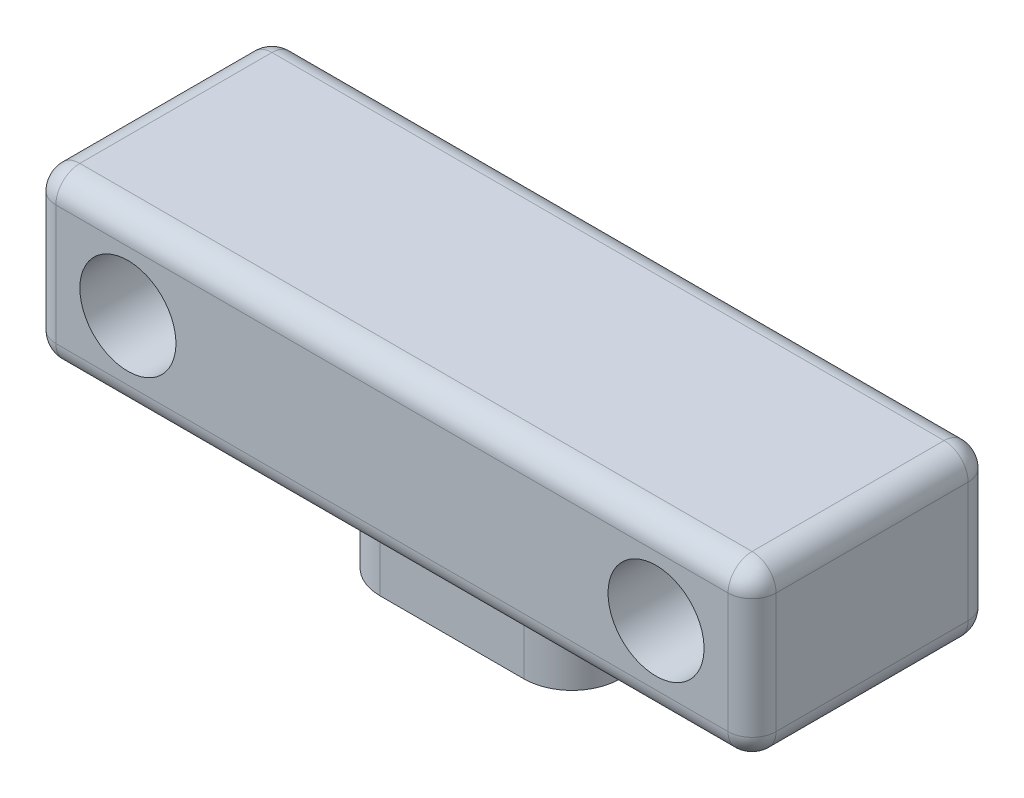
ISO-10303-21;
HEADER;
FILE_DESCRIPTION(('STEP AP214'),'2;1');
FILE_NAME('part.step','',(''),(''),'','','');
FILE_SCHEMA(('AUTOMOTIVE_DESIGN { 1 0 10303 214 1 1 1 1 }'));
ENDSEC;
DATA;
#1=APPLICATION_CONTEXT('core data for automotive mechanical design processes');
#2=APPLICATION_PROTOCOL_DEFINITION('international standard','automotive_design',2000,#1);
#3=PRODUCT_CONTEXT('',#1,'mechanical');
#4=PRODUCT('Part','Part','',(#3));
#5=PRODUCT_RELATED_PRODUCT_CATEGORY('part','',(#4));
#6=PRODUCT_DEFINITION_FORMATION('','',#4);
#7=PRODUCT_DEFINITION_CONTEXT('part definition',#1,'design');
#8=PRODUCT_DEFINITION('design','',#6,#7);
#9=PRODUCT_DEFINITION_SHAPE('','',#8);
#10=(LENGTH_UNIT() NAMED_UNIT(*) SI_UNIT(.MILLI.,.METRE.));
#11=(NAMED_UNIT(*) PLANE_ANGLE_UNIT() SI_UNIT($,.RADIAN.));
#12=(NAMED_UNIT(*) SI_UNIT($,.STERADIAN.) SOLID_ANGLE_UNIT());
#13=UNCERTAINTY_MEASURE_WITH_UNIT(LENGTH_MEASURE(1.E-05),#10,'distance_accuracy_value','');
#14=(GEOMETRIC_REPRESENTATION_CONTEXT(3) GLOBAL_UNCERTAINTY_ASSIGNED_CONTEXT((#13)) GLOBAL_UNIT_ASSIGNED_CONTEXT((#10,
#11,#12)) REPRESENTATION_CONTEXT('',''));
#15=CARTESIAN_POINT('',(0.,0.,0.));
#16=DIRECTION('',(0.,0.,1.));
#17=DIRECTION('',(1.,0.,0.));
#18=AXIS2_PLACEMENT_3D('',#15,#16,#17);
#19=CARTESIAN_POINT('',(0.,-2.,0.));
#20=DIRECTION('',(0.,1.,0.));
#21=DIRECTION('',(0.,0.,1.));
#22=AXIS2_PLACEMENT_3D('',#19,#20,#21);
#23=CYLINDRICAL_SURFACE('',#22,2.);
#24=CARTESIAN_POINT('',(0.,1.85,0.));
#25=DIRECTION('',(0.,1.,0.));
#26=DIRECTION('',(0.,0.,1.));
#27=AXIS2_PLACEMENT_3D('',#24,#25,#26);
#28=CIRCLE('',#27,2.);
#29=CARTESIAN_POINT('',(0.,1.85,2.));
#30=VERTEX_POINT('',#29);
#31=EDGE_CURVE('E331',#30,#30,#28,.T.);
#32=ORIENTED_EDGE('',*,*,#31,.F.);
#33=EDGE_LOOP('',(#32));
#34=FACE_BOUND('',#33,.T.);
#35=CARTESIAN_POINT('',(0.,0.,0.));
#36=DIRECTION('',(0.,-1.,0.));
#37=DIRECTION('',(0.,0.,-1.));
#38=AXIS2_PLACEMENT_3D('',#35,#36,#37);
#39=CIRCLE('',#38,2.);
#40=CARTESIAN_POINT('',(0.,0.,-2.));
#41=VERTEX_POINT('',#40);
#42=EDGE_CURVE('E335',#41,#41,#39,.F.);
#43=ORIENTED_EDGE('',*,*,#42,.T.);
#44=EDGE_LOOP('',(#43));
#45=FACE_BOUND('',#44,.T.);
#46=ADVANCED_FACE('F169',(#34,#45),#23,.T.);
#47=CARTESIAN_POINT('',(15.,8.85,-5.));
#48=DIRECTION('',(-1.,0.,0.));
#49=DIRECTION('',(0.,0.,1.));
#50=AXIS2_PLACEMENT_3D('',#47,#48,#49);
#51=PLANE('',#50);
#52=DIRECTION('',(0.,0.,-1.));
#53=VECTOR('',#52,1.);
#54=CARTESIAN_POINT('',(15.,7.85,5.));
#55=LINE('',#54,#53);
#56=CARTESIAN_POINT('',(15.,7.85,-4.));
#57=VERTEX_POINT('',#56);
#58=CARTESIAN_POINT('',(15.,7.85,4.));
#59=VERTEX_POINT('',#58);
#60=EDGE_CURVE('E395',#57,#59,#55,.F.);
#61=ORIENTED_EDGE('',*,*,#60,.T.);
#62=DIRECTION('',(0.,-1.,0.));
#63=VECTOR('',#62,1.);
#64=CARTESIAN_POINT('',(15.,8.85,4.));
#65=LINE('',#64,#63);
#66=CARTESIAN_POINT('',(15.,2.85,4.));
#67=VERTEX_POINT('',#66);
#68=EDGE_CURVE('E397',#59,#67,#65,.T.);
#69=ORIENTED_EDGE('',*,*,#68,.T.);
#70=DIRECTION('',(0.,0.,-1.));
#71=VECTOR('',#70,1.);
#72=CARTESIAN_POINT('',(15.,2.85,-5.));
#73=LINE('',#72,#71);
#74=CARTESIAN_POINT('',(15.,2.85,-4.));
#75=VERTEX_POINT('',#74);
#76=EDGE_CURVE('E393',#67,#75,#73,.T.);
#77=ORIENTED_EDGE('',*,*,#76,.T.);
#78=DIRECTION('',(0.,-1.,0.));
#79=VECTOR('',#78,1.);
#80=CARTESIAN_POINT('',(15.,8.85,-4.));
#81=LINE('',#80,#79);
#82=EDGE_CURVE('E391',#75,#57,#81,.F.);
#83=ORIENTED_EDGE('',*,*,#82,.T.);
#84=EDGE_LOOP('',(#61,#69,#77,#83));
#85=FACE_BOUND('',#84,.T.);
#86=ADVANCED_FACE('F553',(#85),#51,.F.);
#87=CARTESIAN_POINT('',(-15.,8.85,-5.));
#88=DIRECTION('',(0.,0.,1.));
#89=DIRECTION('',(1.,0.,0.));
#90=AXIS2_PLACEMENT_3D('',#87,#88,#89);
#91=PLANE('',#90);
#92=DIRECTION('',(-1.,0.,0.));
#93=VECTOR('',#92,1.);
#94=CARTESIAN_POINT('',(15.,7.85,-5.));
#95=LINE('',#94,#93);
#96=CARTESIAN_POINT('',(-14.,7.85,-5.));
#97=VERTEX_POINT('',#96);
#98=CARTESIAN_POINT('',(14.,7.85,-5.));
#99=VERTEX_POINT('',#98);
#100=EDGE_CURVE('E404',#97,#99,#95,.F.);
#101=ORIENTED_EDGE('',*,*,#100,.T.);
#102=DIRECTION('',(0.,-1.,0.));
#103=VECTOR('',#102,1.);
#104=CARTESIAN_POINT('',(14.,8.85,-5.));
#105=LINE('',#104,#103);
#106=CARTESIAN_POINT('',(14.,2.85,-5.));
#107=VERTEX_POINT('',#106);
#108=EDGE_CURVE('E406',#99,#107,#105,.T.);
#109=ORIENTED_EDGE('',*,*,#108,.T.);
#110=DIRECTION('',(-1.,0.,0.));
#111=VECTOR('',#110,1.);
#112=CARTESIAN_POINT('',(-15.,2.85,-5.));
#113=LINE('',#112,#111);
#114=CARTESIAN_POINT('',(-14.,2.85,-5.));
#115=VERTEX_POINT('',#114);
#116=EDGE_CURVE('E402',#107,#115,#113,.T.);
#117=ORIENTED_EDGE('',*,*,#116,.T.);
#118=DIRECTION('',(0.,-1.,0.));
#119=VECTOR('',#118,1.);
#120=CARTESIAN_POINT('',(-14.,8.85,-5.));
#121=LINE('',#120,#119);
#122=EDGE_CURVE('E400',#115,#97,#121,.F.);
#123=ORIENTED_EDGE('',*,*,#122,.T.);
#124=EDGE_LOOP('',(#101,#109,#117,#123));
#125=FACE_BOUND('',#124,.T.);
#126=CARTESIAN_POINT('',(11.,5.35,-5.));
#127=DIRECTION('',(0.,0.,-1.));
#128=DIRECTION('',(-1.,0.,0.));
#129=AXIS2_PLACEMENT_3D('',#126,#127,#128);
#130=CIRCLE('',#129,2.);
#131=CARTESIAN_POINT('',(9.,5.35,-5.));
#132=VERTEX_POINT('',#131);
#133=EDGE_CURVE('E492',#132,#132,#130,.T.);
#134=ORIENTED_EDGE('',*,*,#133,.F.);
#135=EDGE_LOOP('',(#134));
#136=FACE_BOUND('',#135,.T.);
#137=CARTESIAN_POINT('',(-11.,5.35,-5.));
#138=DIRECTION('',(0.,0.,-1.));
#139=DIRECTION('',(1.,0.,0.));
#140=AXIS2_PLACEMENT_3D('',#137,#138,#139);
#141=CIRCLE('',#140,2.);
#142=CARTESIAN_POINT('',(-9.,5.35,-5.));
#143=VERTEX_POINT('',#142);
#144=EDGE_CURVE('E487',#143,#143,#141,.T.);
#145=ORIENTED_EDGE('',*,*,#144,.F.);
#146=EDGE_LOOP('',(#145));
#147=FACE_BOUND('',#146,.T.);
#148=ADVANCED_FACE('F560',(#125,#136,#147),#91,.F.);
#149=CARTESIAN_POINT('',(-15.,8.85,-5.));
#150=DIRECTION('',(1.,0.,0.));
#151=DIRECTION('',(0.,0.,-1.));
#152=AXIS2_PLACEMENT_3D('',#149,#150,#151);
#153=PLANE('',#152);
#154=DIRECTION('',(0.,0.,1.));
#155=VECTOR('',#154,1.);
#156=CARTESIAN_POINT('',(-15.,7.85,-5.));
#157=LINE('',#156,#155);
#158=CARTESIAN_POINT('',(-15.,7.85,4.));
#159=VERTEX_POINT('',#158);
#160=CARTESIAN_POINT('',(-15.,7.85,-4.));
#161=VERTEX_POINT('',#160);
#162=EDGE_CURVE('E178',#159,#161,#157,.F.);
#163=ORIENTED_EDGE('',*,*,#162,.T.);
#164=DIRECTION('',(0.,-1.,0.));
#165=VECTOR('',#164,1.);
#166=CARTESIAN_POINT('',(-15.,8.85,-4.));
#167=LINE('',#166,#165);
#168=CARTESIAN_POINT('',(-15.,2.85,-4.));
#169=VERTEX_POINT('',#168);
#170=EDGE_CURVE('E12',#161,#169,#167,.T.);
#171=ORIENTED_EDGE('',*,*,#170,.T.);
#172=DIRECTION('',(0.,0.,1.));
#173=VECTOR('',#172,1.);
#174=CARTESIAN_POINT('',(-15.,2.85,-5.));
#175=LINE('',#174,#173);
#176=CARTESIAN_POINT('',(-15.,2.85,4.));
#177=VERTEX_POINT('',#176);
#178=EDGE_CURVE('E409',#169,#177,#175,.T.);
#179=ORIENTED_EDGE('',*,*,#178,.T.);
#180=DIRECTION('',(0.,-1.,0.));
#181=VECTOR('',#180,1.);
#182=CARTESIAN_POINT('',(-15.,8.85,4.));
#183=LINE('',#182,#181);
#184=EDGE_CURVE('E189',#177,#159,#183,.F.);
#185=ORIENTED_EDGE('',*,*,#184,.T.);
#186=EDGE_LOOP('',(#163,#171,#179,#185));
#187=FACE_BOUND('',#186,.T.);
#188=ADVANCED_FACE('F826',(#187),#153,.F.);
#189=CARTESIAN_POINT('',(-15.,8.85,5.));
#190=DIRECTION('',(0.,0.,-1.));
#191=DIRECTION('',(-1.,0.,0.));
#192=AXIS2_PLACEMENT_3D('',#189,#190,#191);
#193=PLANE('',#192);
#194=DIRECTION('',(1.,0.,0.));
#195=VECTOR('',#194,1.);
#196=CARTESIAN_POINT('',(-15.,2.85,5.));
#197=LINE('',#196,#195);
#198=CARTESIAN_POINT('',(-14.,2.85,5.));
#199=VERTEX_POINT('',#198);
#200=CARTESIAN_POINT('',(14.,2.85,5.));
#201=VERTEX_POINT('',#200);
#202=EDGE_CURVE('E375',#199,#201,#197,.T.);
#203=ORIENTED_EDGE('',*,*,#202,.T.);
#204=DIRECTION('',(0.,-1.,0.));
#205=VECTOR('',#204,1.);
#206=CARTESIAN_POINT('',(14.,8.85,5.));
#207=LINE('',#206,#205);
#208=CARTESIAN_POINT('',(14.,7.85,5.));
#209=VERTEX_POINT('',#208);
#210=EDGE_CURVE('E380',#201,#209,#207,.F.);
#211=ORIENTED_EDGE('',*,*,#210,.T.);
#212=DIRECTION('',(1.,0.,0.));
#213=VECTOR('',#212,1.);
#214=CARTESIAN_POINT('',(-15.,7.85,5.));
#215=LINE('',#214,#213);
#216=CARTESIAN_POINT('',(-14.,7.85,5.));
#217=VERTEX_POINT('',#216);
#218=EDGE_CURVE('E377',#209,#217,#215,.F.);
#219=ORIENTED_EDGE('',*,*,#218,.T.);
#220=DIRECTION('',(0.,-1.,0.));
#221=VECTOR('',#220,1.);
#222=CARTESIAN_POINT('',(-14.,8.85,5.));
#223=LINE('',#222,#221);
#224=EDGE_CURVE('E373',#217,#199,#223,.T.);
#225=ORIENTED_EDGE('',*,*,#224,.T.);
#226=EDGE_LOOP('',(#203,#211,#219,#225));
#227=FACE_BOUND('',#226,.T.);
#228=CARTESIAN_POINT('',(11.,5.35,5.));
#229=DIRECTION('',(0.,0.,-1.));
#230=DIRECTION('',(-1.,0.,0.));
#231=AXIS2_PLACEMENT_3D('',#228,#229,#230);
#232=CIRCLE('',#231,2.);
#233=CARTESIAN_POINT('',(9.,5.35,5.));
#234=VERTEX_POINT('',#233);
#235=EDGE_CURVE('E495',#234,#234,#232,.F.);
#236=ORIENTED_EDGE('',*,*,#235,.F.);
#237=EDGE_LOOP('',(#236));
#238=FACE_BOUND('',#237,.T.);
#239=CARTESIAN_POINT('',(-11.,5.35,5.));
#240=DIRECTION('',(0.,0.,-1.));
#241=DIRECTION('',(-1.,0.,0.));
#242=AXIS2_PLACEMENT_3D('',#239,#240,#241);
#243=CIRCLE('',#242,2.);
#244=CARTESIAN_POINT('',(-13.,5.35,5.));
#245=VERTEX_POINT('',#244);
#246=EDGE_CURVE('E481',#245,#245,#243,.F.);
#247=ORIENTED_EDGE('',*,*,#246,.F.);
#248=EDGE_LOOP('',(#247));
#249=FACE_BOUND('',#248,.T.);
#250=ADVANCED_FACE('F808',(#227,#238,#249),#193,.F.);
#251=CARTESIAN_POINT('',(0.,8.85,0.));
#252=DIRECTION('',(0.,1.,0.));
#253=DIRECTION('',(0.,0.,1.));
#254=AXIS2_PLACEMENT_3D('',#251,#252,#253);
#255=PLANE('',#254);
#256=DIRECTION('',(0.,0.,1.));
#257=VECTOR('',#256,1.);
#258=CARTESIAN_POINT('',(-14.,8.85,5.));
#259=LINE('',#258,#257);
#260=CARTESIAN_POINT('',(-14.,8.85,-4.));
#261=VERTEX_POINT('',#260);
#262=CARTESIAN_POINT('',(-14.,8.85,4.));
#263=VERTEX_POINT('',#262);
#264=EDGE_CURVE('E364',#261,#263,#259,.T.);
#265=ORIENTED_EDGE('',*,*,#264,.T.);
#266=DIRECTION('',(1.,0.,0.));
#267=VECTOR('',#266,1.);
#268=CARTESIAN_POINT('',(15.,8.85,4.));
#269=LINE('',#268,#267);
#270=CARTESIAN_POINT('',(14.,8.85,4.));
#271=VERTEX_POINT('',#270);
#272=EDGE_CURVE('E370',#263,#271,#269,.T.);
#273=ORIENTED_EDGE('',*,*,#272,.T.);
#274=DIRECTION('',(0.,0.,-1.));
#275=VECTOR('',#274,1.);
#276=CARTESIAN_POINT('',(14.,8.85,-5.));
#277=LINE('',#276,#275);
#278=CARTESIAN_POINT('',(14.,8.85,-4.));
#279=VERTEX_POINT('',#278);
#280=EDGE_CURVE('E368',#271,#279,#277,.T.);
#281=ORIENTED_EDGE('',*,*,#280,.T.);
#282=DIRECTION('',(-1.,0.,0.));
#283=VECTOR('',#282,1.);
#284=CARTESIAN_POINT('',(-15.,8.85,-4.));
#285=LINE('',#284,#283);
#286=EDGE_CURVE('E366',#279,#261,#285,.T.);
#287=ORIENTED_EDGE('',*,*,#286,.T.);
#288=EDGE_LOOP('',(#265,#273,#281,#287));
#289=FACE_BOUND('',#288,.T.);
#290=ADVANCED_FACE('F820',(#289),#255,.T.);
#291=CARTESIAN_POINT('',(0.,1.85,0.));
#292=DIRECTION('',(0.,1.,0.));
#293=DIRECTION('',(0.,0.,1.));
#294=AXIS2_PLACEMENT_3D('',#291,#292,#293);
#295=PLANE('',#294);
#296=DIRECTION('',(0.,0.,-1.));
#297=VECTOR('',#296,1.);
#298=CARTESIAN_POINT('',(14.,1.85,0.));
#299=LINE('',#298,#297);
#300=CARTESIAN_POINT('',(14.,1.85,-4.));
#301=VERTEX_POINT('',#300);
#302=CARTESIAN_POINT('',(14.,1.85,4.));
#303=VERTEX_POINT('',#302);
#304=EDGE_CURVE('E386',#301,#303,#299,.F.);
#305=ORIENTED_EDGE('',*,*,#304,.T.);
#306=DIRECTION('',(1.,0.,0.));
#307=VECTOR('',#306,1.);
#308=CARTESIAN_POINT('',(0.,1.85,4.));
#309=LINE('',#308,#307);
#310=CARTESIAN_POINT('',(-14.,1.85,4.));
#311=VERTEX_POINT('',#310);
#312=EDGE_CURVE('E388',#303,#311,#309,.F.);
#313=ORIENTED_EDGE('',*,*,#312,.T.);
#314=DIRECTION('',(0.,0.,1.));
#315=VECTOR('',#314,1.);
#316=CARTESIAN_POINT('',(-14.,1.85,0.));
#317=LINE('',#316,#315);
#318=CARTESIAN_POINT('',(-14.,1.85,-4.));
#319=VERTEX_POINT('',#318);
#320=EDGE_CURVE('E382',#311,#319,#317,.F.);
#321=ORIENTED_EDGE('',*,*,#320,.T.);
#322=DIRECTION('',(-1.,0.,0.));
#323=VECTOR('',#322,1.);
#324=CARTESIAN_POINT('',(0.,1.85,-4.));
#325=LINE('',#324,#323);
#326=EDGE_CURVE('E384',#319,#301,#325,.F.);
#327=ORIENTED_EDGE('',*,*,#326,.T.);
#328=EDGE_LOOP('',(#305,#313,#321,#327));
#329=FACE_BOUND('',#328,.T.);
#330=ORIENTED_EDGE('',*,*,#31,.T.);
#331=EDGE_LOOP('',(#330));
#332=FACE_BOUND('',#331,.T.);
#333=ADVANCED_FACE('F844',(#329,#332),#295,.F.);
#334=CARTESIAN_POINT('',(5.,0.,2.5));
#335=DIRECTION('',(1.,0.,0.));
#336=DIRECTION('',(0.,0.,-1.));
#337=AXIS2_PLACEMENT_3D('',#334,#335,#336);
#338=PLANE('',#337);
#339=DIRECTION('',(0.,0.,1.));
#340=VECTOR('',#339,1.);
#341=CARTESIAN_POINT('',(5.,-2.,2.5));
#342=LINE('',#341,#340);
#343=CARTESIAN_POINT('',(5.,-2.,-0.5));
#344=VERTEX_POINT('',#343);
#345=CARTESIAN_POINT('',(5.,-2.,0.5));
#346=VERTEX_POINT('',#345);
#347=EDGE_CURVE('E508',#344,#346,#342,.T.);
#348=ORIENTED_EDGE('',*,*,#347,.F.);
#349=DIRECTION('',(0.,-1.,0.));
#350=VECTOR('',#349,1.);
#351=CARTESIAN_POINT('',(5.,0.,-0.5));
#352=LINE('',#351,#350);
#353=CARTESIAN_POINT('',(5.,0.,-0.5));
#354=VERTEX_POINT('',#353);
#355=EDGE_CURVE('E346',#344,#354,#352,.F.);
#356=ORIENTED_EDGE('',*,*,#355,.T.);
#357=DIRECTION('',(0.,0.,1.));
#358=VECTOR('',#357,1.);
#359=CARTESIAN_POINT('',(5.,0.,2.5));
#360=LINE('',#359,#358);
#361=CARTESIAN_POINT('',(5.,0.,0.5));
#362=VERTEX_POINT('',#361);
#363=EDGE_CURVE('E326',#354,#362,#360,.T.);
#364=ORIENTED_EDGE('',*,*,#363,.T.);
#365=DIRECTION('',(0.,-1.,0.));
#366=VECTOR('',#365,1.);
#367=CARTESIAN_POINT('',(5.,0.,0.5));
#368=LINE('',#367,#366);
#369=EDGE_CURVE('E343',#362,#346,#368,.T.);
#370=ORIENTED_EDGE('',*,*,#369,.T.);
#371=EDGE_LOOP('',(#348,#356,#364,#370));
#372=FACE_BOUND('',#371,.T.);
#373=ADVANCED_FACE('F530',(#372),#338,.T.);
#374=CARTESIAN_POINT('',(-5.,0.,-2.5));
#375=DIRECTION('',(0.,0.,-1.));
#376=DIRECTION('',(-1.,0.,0.));
#377=AXIS2_PLACEMENT_3D('',#374,#375,#376);
#378=PLANE('',#377);
#379=DIRECTION('',(1.,0.,0.));
#380=VECTOR('',#379,1.);
#381=CARTESIAN_POINT('',(-5.,0.,-2.5));
#382=LINE('',#381,#380);
#383=CARTESIAN_POINT('',(-3.,0.,-2.5));
#384=VERTEX_POINT('',#383);
#385=CARTESIAN_POINT('',(3.,0.,-2.5));
#386=VERTEX_POINT('',#385);
#387=EDGE_CURVE('E506',#384,#386,#382,.T.);
#388=ORIENTED_EDGE('',*,*,#387,.T.);
#389=DIRECTION('',(0.,-1.,0.));
#390=VECTOR('',#389,1.);
#391=CARTESIAN_POINT('',(3.,0.,-2.5));
#392=LINE('',#391,#390);
#393=CARTESIAN_POINT('',(3.,-2.,-2.5));
#394=VERTEX_POINT('',#393);
#395=EDGE_CURVE('E325',#386,#394,#392,.T.);
#396=ORIENTED_EDGE('',*,*,#395,.T.);
#397=DIRECTION('',(1.,0.,0.));
#398=VECTOR('',#397,1.);
#399=CARTESIAN_POINT('',(-5.,-2.,-2.5));
#400=LINE('',#399,#398);
#401=CARTESIAN_POINT('',(-3.,-2.,-2.5));
#402=VERTEX_POINT('',#401);
#403=EDGE_CURVE('E308',#402,#394,#400,.T.);
#404=ORIENTED_EDGE('',*,*,#403,.F.);
#405=DIRECTION('',(0.,-1.,0.));
#406=VECTOR('',#405,1.);
#407=CARTESIAN_POINT('',(-3.,0.,-2.5));
#408=LINE('',#407,#406);
#409=EDGE_CURVE('E322',#402,#384,#408,.F.);
#410=ORIENTED_EDGE('',*,*,#409,.T.);
#411=EDGE_LOOP('',(#388,#396,#404,#410));
#412=FACE_BOUND('',#411,.T.);
#413=ADVANCED_FACE('F321',(#412),#378,.T.);
#414=CARTESIAN_POINT('',(-5.,0.,2.5));
#415=DIRECTION('',(-1.,0.,0.));
#416=DIRECTION('',(0.,0.,1.));
#417=AXIS2_PLACEMENT_3D('',#414,#415,#416);
#418=PLANE('',#417);
#419=DIRECTION('',(0.,0.,-1.));
#420=VECTOR('',#419,1.);
#421=CARTESIAN_POINT('',(-5.,0.,2.5));
#422=LINE('',#421,#420);
#423=CARTESIAN_POINT('',(-5.,0.,0.499999999999999));
#424=VERTEX_POINT('',#423);
#425=CARTESIAN_POINT('',(-5.,0.,-0.500000000000001));
#426=VERTEX_POINT('',#425);
#427=EDGE_CURVE('E503',#424,#426,#422,.T.);
#428=ORIENTED_EDGE('',*,*,#427,.T.);
#429=DIRECTION('',(0.,-1.,0.));
#430=VECTOR('',#429,1.);
#431=CARTESIAN_POINT('',(-5.,0.,-0.500000000000001));
#432=LINE('',#431,#430);
#433=CARTESIAN_POINT('',(-5.,-2.,-0.500000000000001));
#434=VERTEX_POINT('',#433);
#435=EDGE_CURVE('E362',#426,#434,#432,.T.);
#436=ORIENTED_EDGE('',*,*,#435,.T.);
#437=DIRECTION('',(0.,0.,-1.));
#438=VECTOR('',#437,1.);
#439=CARTESIAN_POINT('',(-5.,-2.,2.5));
#440=LINE('',#439,#438);
#441=CARTESIAN_POINT('',(-5.,-2.,0.499999999999999));
#442=VERTEX_POINT('',#441);
#443=EDGE_CURVE('E310',#442,#434,#440,.T.);
#444=ORIENTED_EDGE('',*,*,#443,.F.);
#445=DIRECTION('',(0.,-1.,0.));
#446=VECTOR('',#445,1.);
#447=CARTESIAN_POINT('',(-5.,0.,0.499999999999999));
#448=LINE('',#447,#446);
#449=EDGE_CURVE('E360',#442,#424,#448,.F.);
#450=ORIENTED_EDGE('',*,*,#449,.T.);
#451=EDGE_LOOP('',(#428,#436,#444,#450));
#452=FACE_BOUND('',#451,.T.);
#453=ADVANCED_FACE('F537',(#452),#418,.T.);
#454=CARTESIAN_POINT('',(-5.,0.,2.5));
#455=DIRECTION('',(0.,0.,1.));
#456=DIRECTION('',(1.,0.,0.));
#457=AXIS2_PLACEMENT_3D('',#454,#455,#456);
#458=PLANE('',#457);
#459=DIRECTION('',(-1.,0.,0.));
#460=VECTOR('',#459,1.);
#461=CARTESIAN_POINT('',(-5.,-2.,2.5));
#462=LINE('',#461,#460);
#463=CARTESIAN_POINT('',(3.,-2.,2.5));
#464=VERTEX_POINT('',#463);
#465=CARTESIAN_POINT('',(-3.,-2.,2.5));
#466=VERTEX_POINT('',#465);
#467=EDGE_CURVE('E511',#464,#466,#462,.T.);
#468=ORIENTED_EDGE('',*,*,#467,.F.);
#469=DIRECTION('',(0.,-1.,0.));
#470=VECTOR('',#469,1.);
#471=CARTESIAN_POINT('',(3.,0.,2.5));
#472=LINE('',#471,#470);
#473=CARTESIAN_POINT('',(3.,0.,2.5));
#474=VERTEX_POINT('',#473);
#475=EDGE_CURVE('E358',#464,#474,#472,.F.);
#476=ORIENTED_EDGE('',*,*,#475,.T.);
#477=DIRECTION('',(-1.,0.,0.));
#478=VECTOR('',#477,1.);
#479=CARTESIAN_POINT('',(-5.,0.,2.5));
#480=LINE('',#479,#478);
#481=CARTESIAN_POINT('',(-3.,0.,2.5));
#482=VERTEX_POINT('',#481);
#483=EDGE_CURVE('E500',#474,#482,#480,.T.);
#484=ORIENTED_EDGE('',*,*,#483,.T.);
#485=DIRECTION('',(0.,-1.,0.));
#486=VECTOR('',#485,1.);
#487=CARTESIAN_POINT('',(-3.,0.,2.5));
#488=LINE('',#487,#486);
#489=EDGE_CURVE('E355',#482,#466,#488,.T.);
#490=ORIENTED_EDGE('',*,*,#489,.T.);
#491=EDGE_LOOP('',(#468,#476,#484,#490));
#492=FACE_BOUND('',#491,.T.);
#493=ADVANCED_FACE('F517',(#492),#458,.T.);
#494=CARTESIAN_POINT('',(0.,0.,0.));
#495=DIRECTION('',(0.,-1.,0.));
#496=DIRECTION('',(0.,0.,-1.));
#497=AXIS2_PLACEMENT_3D('',#494,#495,#496);
#498=PLANE('',#497);
#499=ORIENTED_EDGE('',*,*,#42,.F.);
#500=EDGE_LOOP('',(#499));
#501=FACE_BOUND('',#500,.T.);
#502=ORIENTED_EDGE('',*,*,#363,.F.);
#503=CARTESIAN_POINT('',(3.,0.,-0.5));
#504=DIRECTION('',(0.,-1.,0.));
#505=DIRECTION('',(0.,0.,-1.));
#506=AXIS2_PLACEMENT_3D('',#503,#504,#505);
#507=CIRCLE('',#506,2.);
#508=EDGE_CURVE('E353',#354,#386,#507,.F.);
#509=ORIENTED_EDGE('',*,*,#508,.T.);
#510=ORIENTED_EDGE('',*,*,#387,.F.);
#511=CARTESIAN_POINT('',(-3.,0.,-0.5));
#512=DIRECTION('',(0.,-1.,0.));
#513=DIRECTION('',(0.,0.,-1.));
#514=AXIS2_PLACEMENT_3D('',#511,#512,#513);
#515=CIRCLE('',#514,2.);
#516=EDGE_CURVE('E330',#384,#426,#515,.F.);
#517=ORIENTED_EDGE('',*,*,#516,.T.);
#518=ORIENTED_EDGE('',*,*,#427,.F.);
#519=CARTESIAN_POINT('',(-3.,0.,0.5));
#520=DIRECTION('',(0.,-1.,0.));
#521=DIRECTION('',(0.,0.,-1.));
#522=AXIS2_PLACEMENT_3D('',#519,#520,#521);
#523=CIRCLE('',#522,2.);
#524=EDGE_CURVE('E348',#424,#482,#523,.F.);
#525=ORIENTED_EDGE('',*,*,#524,.T.);
#526=ORIENTED_EDGE('',*,*,#483,.F.);
#527=CARTESIAN_POINT('',(3.,0.,0.5));
#528=DIRECTION('',(0.,-1.,0.));
#529=DIRECTION('',(0.,0.,-1.));
#530=AXIS2_PLACEMENT_3D('',#527,#528,#529);
#531=CIRCLE('',#530,2.);
#532=EDGE_CURVE('E351',#474,#362,#531,.F.);
#533=ORIENTED_EDGE('',*,*,#532,.T.);
#534=EDGE_LOOP('',(#502,#509,#510,#517,#518,#525,#526,#533));
#535=FACE_BOUND('',#534,.T.);
#536=ADVANCED_FACE('F526',(#501,#535),#498,.F.);
#537=CARTESIAN_POINT('',(0.,-2.,0.));
#538=DIRECTION('',(0.,1.,0.));
#539=DIRECTION('',(0.,0.,1.));
#540=AXIS2_PLACEMENT_3D('',#537,#538,#539);
#541=PLANE('',#540);
#542=ORIENTED_EDGE('',*,*,#403,.T.);
#543=CARTESIAN_POINT('',(3.,-2.,-0.5));
#544=DIRECTION('',(0.,1.,0.));
#545=DIRECTION('',(0.,0.,1.));
#546=AXIS2_PLACEMENT_3D('',#543,#544,#545);
#547=CIRCLE('',#546,2.);
#548=EDGE_CURVE('E341',#394,#344,#547,.F.);
#549=ORIENTED_EDGE('',*,*,#548,.T.);
#550=ORIENTED_EDGE('',*,*,#347,.T.);
#551=CARTESIAN_POINT('',(3.,-2.,0.5));
#552=DIRECTION('',(0.,1.,0.));
#553=DIRECTION('',(0.,0.,1.));
#554=AXIS2_PLACEMENT_3D('',#551,#552,#553);
#555=CIRCLE('',#554,2.);
#556=EDGE_CURVE('E315',#346,#464,#555,.F.);
#557=ORIENTED_EDGE('',*,*,#556,.T.);
#558=ORIENTED_EDGE('',*,*,#467,.T.);
#559=CARTESIAN_POINT('',(-3.,-2.,0.5));
#560=DIRECTION('',(0.,1.,0.));
#561=DIRECTION('',(0.,0.,1.));
#562=AXIS2_PLACEMENT_3D('',#559,#560,#561);
#563=CIRCLE('',#562,2.);
#564=EDGE_CURVE('E316',#466,#442,#563,.F.);
#565=ORIENTED_EDGE('',*,*,#564,.T.);
#566=ORIENTED_EDGE('',*,*,#443,.T.);
#567=CARTESIAN_POINT('',(-3.,-2.,-0.5));
#568=DIRECTION('',(0.,1.,0.));
#569=DIRECTION('',(0.,0.,1.));
#570=AXIS2_PLACEMENT_3D('',#567,#568,#569);
#571=CIRCLE('',#570,2.);
#572=EDGE_CURVE('E305',#434,#402,#571,.F.);
#573=ORIENTED_EDGE('',*,*,#572,.T.);
#574=EDGE_LOOP('',(#542,#549,#550,#557,#558,#565,#566,#573));
#575=FACE_BOUND('',#574,.T.);
#576=ADVANCED_FACE('F307',(#575),#541,.F.);
#577=CARTESIAN_POINT('',(3.,0.,-0.5));
#578=DIRECTION('',(0.,-1.,0.));
#579=DIRECTION('',(0.,0.,-1.));
#580=AXIS2_PLACEMENT_3D('',#577,#578,#579);
#581=CYLINDRICAL_SURFACE('',#580,2.);
#582=ORIENTED_EDGE('',*,*,#508,.F.);
#583=ORIENTED_EDGE('',*,*,#355,.F.);
#584=ORIENTED_EDGE('',*,*,#548,.F.);
#585=ORIENTED_EDGE('',*,*,#395,.F.);
#586=EDGE_LOOP('',(#582,#583,#584,#585));
#587=FACE_BOUND('',#586,.T.);
#588=ADVANCED_FACE('F533',(#587),#581,.T.);
#589=CARTESIAN_POINT('',(3.,0.,0.5));
#590=DIRECTION('',(0.,-1.,0.));
#591=DIRECTION('',(0.,0.,-1.));
#592=AXIS2_PLACEMENT_3D('',#589,#590,#591);
#593=CYLINDRICAL_SURFACE('',#592,2.);
#594=ORIENTED_EDGE('',*,*,#532,.F.);
#595=ORIENTED_EDGE('',*,*,#475,.F.);
#596=ORIENTED_EDGE('',*,*,#556,.F.);
#597=ORIENTED_EDGE('',*,*,#369,.F.);
#598=EDGE_LOOP('',(#594,#595,#596,#597));
#599=FACE_BOUND('',#598,.T.);
#600=ADVANCED_FACE('F522',(#599),#593,.T.);
#601=CARTESIAN_POINT('',(-3.,0.,-0.5));
#602=DIRECTION('',(0.,-1.,0.));
#603=DIRECTION('',(0.,0.,-1.));
#604=AXIS2_PLACEMENT_3D('',#601,#602,#603);
#605=CYLINDRICAL_SURFACE('',#604,2.);
#606=ORIENTED_EDGE('',*,*,#516,.F.);
#607=ORIENTED_EDGE('',*,*,#409,.F.);
#608=ORIENTED_EDGE('',*,*,#572,.F.);
#609=ORIENTED_EDGE('',*,*,#435,.F.);
#610=EDGE_LOOP('',(#606,#607,#608,#609));
#611=FACE_BOUND('',#610,.T.);
#612=ADVANCED_FACE('F329',(#611),#605,.T.);
#613=CARTESIAN_POINT('',(-3.,0.,0.5));
#614=DIRECTION('',(0.,-1.,0.));
#615=DIRECTION('',(0.,0.,-1.));
#616=AXIS2_PLACEMENT_3D('',#613,#614,#615);
#617=CYLINDRICAL_SURFACE('',#616,2.);
#618=ORIENTED_EDGE('',*,*,#524,.F.);
#619=ORIENTED_EDGE('',*,*,#449,.F.);
#620=ORIENTED_EDGE('',*,*,#564,.F.);
#621=ORIENTED_EDGE('',*,*,#489,.F.);
#622=EDGE_LOOP('',(#618,#619,#620,#621));
#623=FACE_BOUND('',#622,.T.);
#624=ADVANCED_FACE('F540',(#623),#617,.T.);
#625=CARTESIAN_POINT('',(-11.,5.35,10.6568542494924));
#626=DIRECTION('',(0.,0.,-1.));
#627=DIRECTION('',(-1.,0.,0.));
#628=AXIS2_PLACEMENT_3D('',#625,#626,#627);
#629=CYLINDRICAL_SURFACE('',#628,2.);
#630=ORIENTED_EDGE('',*,*,#246,.T.);
#631=EDGE_LOOP('',(#630));
#632=FACE_BOUND('',#631,.T.);
#633=ORIENTED_EDGE('',*,*,#144,.T.);
#634=EDGE_LOOP('',(#633));
#635=FACE_BOUND('',#634,.T.);
#636=ADVANCED_FACE('F542',(#632,#635),#629,.F.);
#637=CARTESIAN_POINT('',(11.,5.35,10.6568542494924));
#638=DIRECTION('',(0.,0.,-1.));
#639=DIRECTION('',(-1.,0.,0.));
#640=AXIS2_PLACEMENT_3D('',#637,#638,#639);
#641=CYLINDRICAL_SURFACE('',#640,2.);
#642=ORIENTED_EDGE('',*,*,#235,.T.);
#643=EDGE_LOOP('',(#642));
#644=FACE_BOUND('',#643,.T.);
#645=ORIENTED_EDGE('',*,*,#133,.T.);
#646=EDGE_LOOP('',(#645));
#647=FACE_BOUND('',#646,.T.);
#648=ADVANCED_FACE('F548',(#644,#647),#641,.F.);
#649=CARTESIAN_POINT('',(-15.,2.85,-4.));
#650=DIRECTION('',(-1.,0.,0.));
#651=DIRECTION('',(0.,0.,1.));
#652=AXIS2_PLACEMENT_3D('',#649,#650,#651);
#653=CYLINDRICAL_SURFACE('',#652,1.);
#654=CARTESIAN_POINT('',(-14.,2.85,-4.));
#655=DIRECTION('',(-1.,0.,0.));
#656=DIRECTION('',(0.,0.,1.));
#657=AXIS2_PLACEMENT_3D('',#654,#655,#656);
#658=CIRCLE('',#657,1.);
#659=EDGE_CURVE('E173',#115,#319,#658,.T.);
#660=ORIENTED_EDGE('',*,*,#659,.F.);
#661=ORIENTED_EDGE('',*,*,#116,.F.);
#662=CARTESIAN_POINT('',(14.,2.85,-4.));
#663=DIRECTION('',(1.,0.,0.));
#664=DIRECTION('',(0.,0.,-1.));
#665=AXIS2_PLACEMENT_3D('',#662,#663,#664);
#666=CIRCLE('',#665,1.);
#667=EDGE_CURVE('E473',#301,#107,#666,.T.);
#668=ORIENTED_EDGE('',*,*,#667,.F.);
#669=ORIENTED_EDGE('',*,*,#326,.F.);
#670=EDGE_LOOP('',(#660,#661,#668,#669));
#671=FACE_BOUND('',#670,.T.);
#672=ADVANCED_FACE('F171',(#671),#653,.T.);
#673=CARTESIAN_POINT('',(-14.,2.85,-4.));
#674=DIRECTION('',(0.,-1.,0.));
#675=DIRECTION('',(0.,0.,-1.));
#676=AXIS2_PLACEMENT_3D('',#673,#674,#675);
#677=SPHERICAL_SURFACE('',#676,1.);
#678=CARTESIAN_POINT('',(-14.,2.85,-4.));
#679=DIRECTION('',(0.,-1.,0.));
#680=DIRECTION('',(0.,0.,-1.));
#681=AXIS2_PLACEMENT_3D('',#678,#679,#680);
#682=CIRCLE('',#681,1.);
#683=EDGE_CURVE('E468',#115,#169,#682,.F.);
#684=ORIENTED_EDGE('',*,*,#683,.F.);
#685=ORIENTED_EDGE('',*,*,#659,.T.);
#686=CARTESIAN_POINT('',(-14.,2.85,-4.));
#687=DIRECTION('',(0.,0.,-1.));
#688=DIRECTION('',(-1.,0.,0.));
#689=AXIS2_PLACEMENT_3D('',#686,#687,#688);
#690=CIRCLE('',#689,1.);
#691=EDGE_CURVE('E471',#169,#319,#690,.F.);
#692=ORIENTED_EDGE('',*,*,#691,.F.);
#693=EDGE_LOOP('',(#684,#685,#692));
#694=FACE_BOUND('',#693,.T.);
#695=ADVANCED_FACE('F609',(#694),#677,.T.);
#696=CARTESIAN_POINT('',(14.,2.85,-4.));
#697=DIRECTION('',(0.,0.,-1.));
#698=DIRECTION('',(-1.,0.,0.));
#699=AXIS2_PLACEMENT_3D('',#696,#697,#698);
#700=SPHERICAL_SURFACE('',#699,1.);
#701=CARTESIAN_POINT('',(14.,2.85,-4.));
#702=DIRECTION('',(0.,0.,-1.));
#703=DIRECTION('',(-1.,0.,0.));
#704=AXIS2_PLACEMENT_3D('',#701,#702,#703);
#705=CIRCLE('',#704,1.);
#706=EDGE_CURVE('E463',#301,#75,#705,.F.);
#707=ORIENTED_EDGE('',*,*,#706,.F.);
#708=ORIENTED_EDGE('',*,*,#667,.T.);
#709=CARTESIAN_POINT('',(14.,2.85,-4.));
#710=DIRECTION('',(0.,-1.,0.));
#711=DIRECTION('',(0.,0.,-1.));
#712=AXIS2_PLACEMENT_3D('',#709,#710,#711);
#713=CIRCLE('',#712,1.);
#714=EDGE_CURVE('E466',#75,#107,#713,.F.);
#715=ORIENTED_EDGE('',*,*,#714,.F.);
#716=EDGE_LOOP('',(#707,#708,#715));
#717=FACE_BOUND('',#716,.T.);
#718=ADVANCED_FACE('F619',(#717),#700,.T.);
#719=CARTESIAN_POINT('',(-14.,2.85,-5.));
#720=DIRECTION('',(0.,0.,1.));
#721=DIRECTION('',(1.,0.,0.));
#722=AXIS2_PLACEMENT_3D('',#719,#720,#721);
#723=CYLINDRICAL_SURFACE('',#722,1.);
#724=ORIENTED_EDGE('',*,*,#691,.T.);
#725=ORIENTED_EDGE('',*,*,#320,.F.);
#726=CARTESIAN_POINT('',(-14.,2.85,4.));
#727=DIRECTION('',(0.,0.,1.));
#728=DIRECTION('',(1.,0.,0.));
#729=AXIS2_PLACEMENT_3D('',#726,#727,#728);
#730=CIRCLE('',#729,1.);
#731=EDGE_CURVE('E458',#177,#311,#730,.T.);
#732=ORIENTED_EDGE('',*,*,#731,.F.);
#733=ORIENTED_EDGE('',*,*,#178,.F.);
#734=EDGE_LOOP('',(#724,#725,#732,#733));
#735=FACE_BOUND('',#734,.T.);
#736=ADVANCED_FACE('F627',(#735),#723,.T.);
#737=CARTESIAN_POINT('',(-14.,8.85,-4.));
#738=DIRECTION('',(0.,-1.,0.));
#739=DIRECTION('',(0.,0.,-1.));
#740=AXIS2_PLACEMENT_3D('',#737,#738,#739);
#741=CYLINDRICAL_SURFACE('',#740,1.);
#742=ORIENTED_EDGE('',*,*,#683,.T.);
#743=ORIENTED_EDGE('',*,*,#170,.F.);
#744=CARTESIAN_POINT('',(-14.,7.85,-4.));
#745=DIRECTION('',(0.,1.,0.));
#746=DIRECTION('',(0.,0.,1.));
#747=AXIS2_PLACEMENT_3D('',#744,#745,#746);
#748=CIRCLE('',#747,1.);
#749=EDGE_CURVE('E455',#97,#161,#748,.T.);
#750=ORIENTED_EDGE('',*,*,#749,.F.);
#751=ORIENTED_EDGE('',*,*,#122,.F.);
#752=EDGE_LOOP('',(#742,#743,#750,#751));
#753=FACE_BOUND('',#752,.T.);
#754=ADVANCED_FACE('F636',(#753),#741,.T.);
#755=CARTESIAN_POINT('',(0.,7.85,-4.));
#756=DIRECTION('',(1.,0.,0.));
#757=DIRECTION('',(0.,0.,-1.));
#758=AXIS2_PLACEMENT_3D('',#755,#756,#757);
#759=CYLINDRICAL_SURFACE('',#758,1.);
#760=CARTESIAN_POINT('',(14.,7.85,-4.));
#761=DIRECTION('',(1.,0.,0.));
#762=DIRECTION('',(0.,1.,0.));
#763=AXIS2_PLACEMENT_3D('',#760,#761,#762);
#764=CIRCLE('',#763,1.);
#765=EDGE_CURVE('E449',#99,#279,#764,.T.);
#766=ORIENTED_EDGE('',*,*,#765,.F.);
#767=ORIENTED_EDGE('',*,*,#100,.F.);
#768=CARTESIAN_POINT('',(-14.,7.85,-4.));
#769=DIRECTION('',(-1.,0.,0.));
#770=DIRECTION('',(0.,0.,1.));
#771=AXIS2_PLACEMENT_3D('',#768,#769,#770);
#772=CIRCLE('',#771,1.);
#773=EDGE_CURVE('E452',#261,#97,#772,.T.);
#774=ORIENTED_EDGE('',*,*,#773,.F.);
#775=ORIENTED_EDGE('',*,*,#286,.F.);
#776=EDGE_LOOP('',(#766,#767,#774,#775));
#777=FACE_BOUND('',#776,.T.);
#778=ADVANCED_FACE('F646',(#777),#759,.T.);
#779=CARTESIAN_POINT('',(14.,8.85,-4.));
#780=DIRECTION('',(0.,-1.,0.));
#781=DIRECTION('',(0.,0.,-1.));
#782=AXIS2_PLACEMENT_3D('',#779,#780,#781);
#783=CYLINDRICAL_SURFACE('',#782,1.);
#784=ORIENTED_EDGE('',*,*,#714,.T.);
#785=ORIENTED_EDGE('',*,*,#108,.F.);
#786=CARTESIAN_POINT('',(14.,7.85,-4.));
#787=DIRECTION('',(0.,1.,0.));
#788=DIRECTION('',(0.,0.,1.));
#789=AXIS2_PLACEMENT_3D('',#786,#787,#788);
#790=CIRCLE('',#789,1.);
#791=EDGE_CURVE('E446',#57,#99,#790,.T.);
#792=ORIENTED_EDGE('',*,*,#791,.F.);
#793=ORIENTED_EDGE('',*,*,#82,.F.);
#794=EDGE_LOOP('',(#784,#785,#792,#793));
#795=FACE_BOUND('',#794,.T.);
#796=ADVANCED_FACE('F656',(#795),#783,.T.);
#797=CARTESIAN_POINT('',(14.,2.85,-5.));
#798=DIRECTION('',(0.,0.,-1.));
#799=DIRECTION('',(-1.,0.,0.));
#800=AXIS2_PLACEMENT_3D('',#797,#798,#799);
#801=CYLINDRICAL_SURFACE('',#800,1.);
#802=ORIENTED_EDGE('',*,*,#706,.T.);
#803=ORIENTED_EDGE('',*,*,#76,.F.);
#804=CARTESIAN_POINT('',(14.,2.85,4.));
#805=DIRECTION('',(0.,0.,1.));
#806=DIRECTION('',(1.,0.,0.));
#807=AXIS2_PLACEMENT_3D('',#804,#805,#806);
#808=CIRCLE('',#807,1.);
#809=EDGE_CURVE('E443',#303,#67,#808,.T.);
#810=ORIENTED_EDGE('',*,*,#809,.F.);
#811=ORIENTED_EDGE('',*,*,#304,.F.);
#812=EDGE_LOOP('',(#802,#803,#810,#811));
#813=FACE_BOUND('',#812,.T.);
#814=ADVANCED_FACE('F666',(#813),#801,.T.);
#815=CARTESIAN_POINT('',(-15.,2.85,4.));
#816=DIRECTION('',(1.,0.,0.));
#817=DIRECTION('',(0.,0.,-1.));
#818=AXIS2_PLACEMENT_3D('',#815,#816,#817);
#819=CYLINDRICAL_SURFACE('',#818,1.);
#820=CARTESIAN_POINT('',(-14.,2.85,4.));
#821=DIRECTION('',(-1.,0.,0.));
#822=DIRECTION('',(0.,0.,1.));
#823=AXIS2_PLACEMENT_3D('',#820,#821,#822);
#824=CIRCLE('',#823,1.);
#825=EDGE_CURVE('E460',#311,#199,#824,.T.);
#826=ORIENTED_EDGE('',*,*,#825,.F.);
#827=ORIENTED_EDGE('',*,*,#312,.F.);
#828=CARTESIAN_POINT('',(14.,2.85,4.));
#829=DIRECTION('',(1.,0.,0.));
#830=DIRECTION('',(0.,0.,-1.));
#831=AXIS2_PLACEMENT_3D('',#828,#829,#830);
#832=CIRCLE('',#831,1.);
#833=EDGE_CURVE('E440',#201,#303,#832,.T.);
#834=ORIENTED_EDGE('',*,*,#833,.F.);
#835=ORIENTED_EDGE('',*,*,#202,.F.);
#836=EDGE_LOOP('',(#826,#827,#834,#835));
#837=FACE_BOUND('',#836,.T.);
#838=ADVANCED_FACE('F676',(#837),#819,.T.);
#839=CARTESIAN_POINT('',(-14.,2.85,4.));
#840=DIRECTION('',(0.,-1.,0.));
#841=DIRECTION('',(0.,0.,-1.));
#842=AXIS2_PLACEMENT_3D('',#839,#840,#841);
#843=SPHERICAL_SURFACE('',#842,1.);
#844=ORIENTED_EDGE('',*,*,#731,.T.);
#845=ORIENTED_EDGE('',*,*,#825,.T.);
#846=CARTESIAN_POINT('',(-14.,2.85,4.));
#847=DIRECTION('',(0.,-1.,0.));
#848=DIRECTION('',(0.,0.,-1.));
#849=AXIS2_PLACEMENT_3D('',#846,#847,#848);
#850=CIRCLE('',#849,1.);
#851=EDGE_CURVE('E437',#177,#199,#850,.F.);
#852=ORIENTED_EDGE('',*,*,#851,.F.);
#853=EDGE_LOOP('',(#844,#845,#852));
#854=FACE_BOUND('',#853,.T.);
#855=ADVANCED_FACE('F686',(#854),#843,.T.);
#856=CARTESIAN_POINT('',(-14.,7.85,-4.));
#857=DIRECTION('',(0.,0.,-1.));
#858=DIRECTION('',(-1.,0.,0.));
#859=AXIS2_PLACEMENT_3D('',#856,#857,#858);
#860=SPHERICAL_SURFACE('',#859,1.);
#861=ORIENTED_EDGE('',*,*,#773,.T.);
#862=ORIENTED_EDGE('',*,*,#749,.T.);
#863=CARTESIAN_POINT('',(-14.,7.85,-4.));
#864=DIRECTION('',(0.,0.,-1.));
#865=DIRECTION('',(-1.,0.,0.));
#866=AXIS2_PLACEMENT_3D('',#863,#864,#865);
#867=CIRCLE('',#866,1.);
#868=EDGE_CURVE('E434',#261,#161,#867,.F.);
#869=ORIENTED_EDGE('',*,*,#868,.F.);
#870=EDGE_LOOP('',(#861,#862,#869));
#871=FACE_BOUND('',#870,.T.);
#872=ADVANCED_FACE('F696',(#871),#860,.T.);
#873=CARTESIAN_POINT('',(14.,7.85,-4.));
#874=DIRECTION('',(0.,0.,-1.));
#875=DIRECTION('',(-1.,0.,0.));
#876=AXIS2_PLACEMENT_3D('',#873,#874,#875);
#877=SPHERICAL_SURFACE('',#876,1.);
#878=ORIENTED_EDGE('',*,*,#791,.T.);
#879=ORIENTED_EDGE('',*,*,#765,.T.);
#880=CARTESIAN_POINT('',(14.,7.85,-4.));
#881=DIRECTION('',(0.,0.,-1.));
#882=DIRECTION('',(-1.,0.,0.));
#883=AXIS2_PLACEMENT_3D('',#880,#881,#882);
#884=CIRCLE('',#883,1.);
#885=EDGE_CURVE('E431',#57,#279,#884,.F.);
#886=ORIENTED_EDGE('',*,*,#885,.F.);
#887=EDGE_LOOP('',(#878,#879,#886));
#888=FACE_BOUND('',#887,.T.);
#889=ADVANCED_FACE('F706',(#888),#877,.T.);
#890=CARTESIAN_POINT('',(14.,2.85,4.));
#891=DIRECTION('',(0.,-1.,0.));
#892=DIRECTION('',(0.,0.,-1.));
#893=AXIS2_PLACEMENT_3D('',#890,#891,#892);
#894=SPHERICAL_SURFACE('',#893,1.);
#895=ORIENTED_EDGE('',*,*,#833,.T.);
#896=ORIENTED_EDGE('',*,*,#809,.T.);
#897=CARTESIAN_POINT('',(14.,2.85,4.));
#898=DIRECTION('',(0.,-1.,0.));
#899=DIRECTION('',(0.,0.,-1.));
#900=AXIS2_PLACEMENT_3D('',#897,#898,#899);
#901=CIRCLE('',#900,1.);
#902=EDGE_CURVE('E429',#201,#67,#901,.F.);
#903=ORIENTED_EDGE('',*,*,#902,.F.);
#904=EDGE_LOOP('',(#895,#896,#903));
#905=FACE_BOUND('',#904,.T.);
#906=ADVANCED_FACE('F716',(#905),#894,.T.);
#907=CARTESIAN_POINT('',(-14.,8.85,4.));
#908=DIRECTION('',(0.,-1.,0.));
#909=DIRECTION('',(0.,0.,-1.));
#910=AXIS2_PLACEMENT_3D('',#907,#908,#909);
#911=CYLINDRICAL_SURFACE('',#910,1.);
#912=ORIENTED_EDGE('',*,*,#851,.T.);
#913=ORIENTED_EDGE('',*,*,#224,.F.);
#914=CARTESIAN_POINT('',(-14.,7.85,4.));
#915=DIRECTION('',(0.,1.,0.));
#916=DIRECTION('',(0.,0.,1.));
#917=AXIS2_PLACEMENT_3D('',#914,#915,#916);
#918=CIRCLE('',#917,1.);
#919=EDGE_CURVE('E426',#159,#217,#918,.T.);
#920=ORIENTED_EDGE('',*,*,#919,.F.);
#921=ORIENTED_EDGE('',*,*,#184,.F.);
#922=EDGE_LOOP('',(#912,#913,#920,#921));
#923=FACE_BOUND('',#922,.T.);
#924=ADVANCED_FACE('F726',(#923),#911,.T.);
#925=CARTESIAN_POINT('',(-14.,7.85,0.));
#926=DIRECTION('',(0.,0.,-1.));
#927=DIRECTION('',(-1.,0.,0.));
#928=AXIS2_PLACEMENT_3D('',#925,#926,#927);
#929=CYLINDRICAL_SURFACE('',#928,1.);
#930=ORIENTED_EDGE('',*,*,#868,.T.);
#931=ORIENTED_EDGE('',*,*,#162,.F.);
#932=CARTESIAN_POINT('',(-14.,7.85,4.));
#933=DIRECTION('',(0.,0.,1.));
#934=DIRECTION('',(1.,0.,0.));
#935=AXIS2_PLACEMENT_3D('',#932,#933,#934);
#936=CIRCLE('',#935,1.);
#937=EDGE_CURVE('E423',#263,#159,#936,.T.);
#938=ORIENTED_EDGE('',*,*,#937,.F.);
#939=ORIENTED_EDGE('',*,*,#264,.F.);
#940=EDGE_LOOP('',(#930,#931,#938,#939));
#941=FACE_BOUND('',#940,.T.);
#942=ADVANCED_FACE('F736',(#941),#929,.T.);
#943=CARTESIAN_POINT('',(14.,7.85,0.));
#944=DIRECTION('',(0.,0.,1.));
#945=DIRECTION('',(1.,0.,0.));
#946=AXIS2_PLACEMENT_3D('',#943,#944,#945);
#947=CYLINDRICAL_SURFACE('',#946,1.);
#948=ORIENTED_EDGE('',*,*,#885,.T.);
#949=ORIENTED_EDGE('',*,*,#280,.F.);
#950=CARTESIAN_POINT('',(14.,7.85,4.));
#951=DIRECTION('',(0.,0.,1.));
#952=DIRECTION('',(0.,-1.,0.));
#953=AXIS2_PLACEMENT_3D('',#950,#951,#952);
#954=CIRCLE('',#953,1.);
#955=EDGE_CURVE('E420',#59,#271,#954,.T.);
#956=ORIENTED_EDGE('',*,*,#955,.F.);
#957=ORIENTED_EDGE('',*,*,#60,.F.);
#958=EDGE_LOOP('',(#948,#949,#956,#957));
#959=FACE_BOUND('',#958,.T.);
#960=ADVANCED_FACE('F746',(#959),#947,.T.);
#961=CARTESIAN_POINT('',(14.,8.85,4.));
#962=DIRECTION('',(0.,-1.,0.));
#963=DIRECTION('',(0.,0.,-1.));
#964=AXIS2_PLACEMENT_3D('',#961,#962,#963);
#965=CYLINDRICAL_SURFACE('',#964,1.);
#966=ORIENTED_EDGE('',*,*,#902,.T.);
#967=ORIENTED_EDGE('',*,*,#68,.F.);
#968=CARTESIAN_POINT('',(14.,7.85,4.));
#969=DIRECTION('',(0.,1.,0.));
#970=DIRECTION('',(0.,0.,1.));
#971=AXIS2_PLACEMENT_3D('',#968,#969,#970);
#972=CIRCLE('',#971,1.);
#973=EDGE_CURVE('E417',#209,#59,#972,.T.);
#974=ORIENTED_EDGE('',*,*,#973,.F.);
#975=ORIENTED_EDGE('',*,*,#210,.F.);
#976=EDGE_LOOP('',(#966,#967,#974,#975));
#977=FACE_BOUND('',#976,.T.);
#978=ADVANCED_FACE('F756',(#977),#965,.T.);
#979=CARTESIAN_POINT('',(-14.,7.85,4.));
#980=DIRECTION('',(-1.,0.,0.));
#981=DIRECTION('',(0.,0.,1.));
#982=AXIS2_PLACEMENT_3D('',#979,#980,#981);
#983=SPHERICAL_SURFACE('',#982,1.);
#984=ORIENTED_EDGE('',*,*,#937,.T.);
#985=ORIENTED_EDGE('',*,*,#919,.T.);
#986=CARTESIAN_POINT('',(-14.,7.85,4.));
#987=DIRECTION('',(-1.,0.,0.));
#988=DIRECTION('',(0.,-1.,0.));
#989=AXIS2_PLACEMENT_3D('',#986,#987,#988);
#990=CIRCLE('',#989,1.);
#991=EDGE_CURVE('E415',#263,#217,#990,.F.);
#992=ORIENTED_EDGE('',*,*,#991,.F.);
#993=EDGE_LOOP('',(#984,#985,#992));
#994=FACE_BOUND('',#993,.T.);
#995=ADVANCED_FACE('F766',(#994),#983,.T.);
#996=CARTESIAN_POINT('',(14.,7.85,4.));
#997=DIRECTION('',(1.,0.,0.));
#998=DIRECTION('',(0.,0.,-1.));
#999=AXIS2_PLACEMENT_3D('',#996,#997,#998);
#1000=SPHERICAL_SURFACE('',#999,1.);
#1001=ORIENTED_EDGE('',*,*,#973,.T.);
#1002=ORIENTED_EDGE('',*,*,#955,.T.);
#1003=CARTESIAN_POINT('',(14.,7.85,4.));
#1004=DIRECTION('',(1.,0.,0.));
#1005=DIRECTION('',(0.,0.,-1.));
#1006=AXIS2_PLACEMENT_3D('',#1003,#1004,#1005);
#1007=CIRCLE('',#1006,1.);
#1008=EDGE_CURVE('E413',#209,#271,#1007,.F.);
#1009=ORIENTED_EDGE('',*,*,#1008,.F.);
#1010=EDGE_LOOP('',(#1001,#1002,#1009));
#1011=FACE_BOUND('',#1010,.T.);
#1012=ADVANCED_FACE('F776',(#1011),#1000,.T.);
#1013=CARTESIAN_POINT('',(0.,7.85,4.));
#1014=DIRECTION('',(-1.,0.,0.));
#1015=DIRECTION('',(0.,0.,1.));
#1016=AXIS2_PLACEMENT_3D('',#1013,#1014,#1015);
#1017=CYLINDRICAL_SURFACE('',#1016,1.);
#1018=ORIENTED_EDGE('',*,*,#991,.T.);
#1019=ORIENTED_EDGE('',*,*,#218,.F.);
#1020=ORIENTED_EDGE('',*,*,#1008,.T.);
#1021=ORIENTED_EDGE('',*,*,#272,.F.);
#1022=EDGE_LOOP('',(#1018,#1019,#1020,#1021));
#1023=FACE_BOUND('',#1022,.T.);
#1024=ADVANCED_FACE('F786',(#1023),#1017,.T.);
#1025=CLOSED_SHELL('',(#46,#86,#148,#188,#250,#290,#333,#373,#413,#453,#493,#536,#576,#588,#600,
#612,#624,#636,#648,#672,#695,#718,#736,#754,#778,#796,#814,#838,#855,#872,#889,#906,#924,#942,
#960,#978,#995,#1012,#1024));
#1026=MANIFOLD_SOLID_BREP('B2',#1025);
#1027=ADVANCED_BREP_SHAPE_REPRESENTATION('',(#18,#1026),#14);
#1028=SHAPE_DEFINITION_REPRESENTATION(#9,#1027);
ENDSEC;
END-ISO-10303-21;
